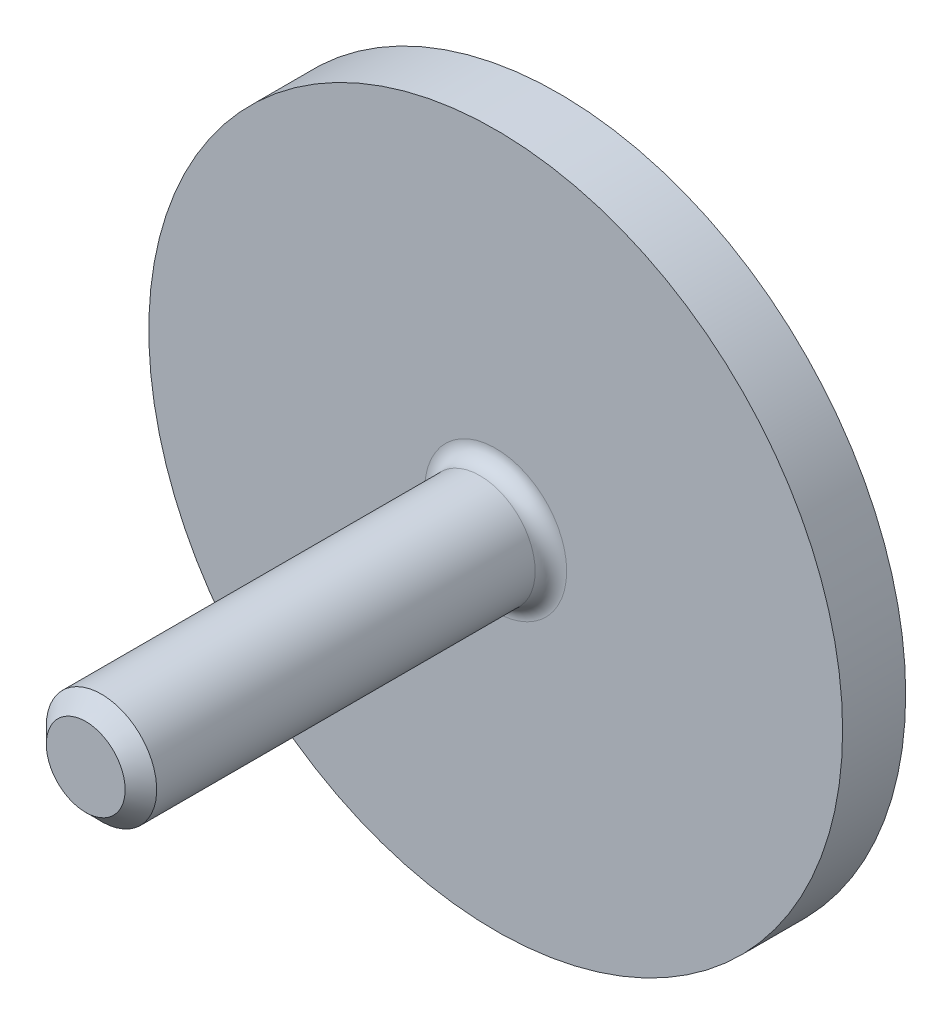
ISO-10303-21;
HEADER;
FILE_DESCRIPTION(('STEP AP214'),'2;1');
FILE_NAME('part.step','',(''),(''),'','','');
FILE_SCHEMA(('AUTOMOTIVE_DESIGN { 1 0 10303 214 1 1 1 1 }'));
ENDSEC;
DATA;
#1=APPLICATION_CONTEXT('core data for automotive mechanical design processes');
#2=APPLICATION_PROTOCOL_DEFINITION('international standard','automotive_design',2000,#1);
#3=PRODUCT_CONTEXT('',#1,'mechanical');
#4=PRODUCT('Part','Part','',(#3));
#5=PRODUCT_RELATED_PRODUCT_CATEGORY('part','',(#4));
#6=PRODUCT_DEFINITION_FORMATION('','',#4);
#7=PRODUCT_DEFINITION_CONTEXT('part definition',#1,'design');
#8=PRODUCT_DEFINITION('design','',#6,#7);
#9=PRODUCT_DEFINITION_SHAPE('','',#8);
#10=(LENGTH_UNIT() NAMED_UNIT(*) SI_UNIT(.MILLI.,.METRE.));
#11=(NAMED_UNIT(*) PLANE_ANGLE_UNIT() SI_UNIT($,.RADIAN.));
#12=(NAMED_UNIT(*) SI_UNIT($,.STERADIAN.) SOLID_ANGLE_UNIT());
#13=UNCERTAINTY_MEASURE_WITH_UNIT(LENGTH_MEASURE(1.E-05),#10,'distance_accuracy_value','');
#14=(GEOMETRIC_REPRESENTATION_CONTEXT(3) GLOBAL_UNCERTAINTY_ASSIGNED_CONTEXT((#13)) GLOBAL_UNIT_ASSIGNED_CONTEXT((#10,
#11,#12)) REPRESENTATION_CONTEXT('',''));
#15=CARTESIAN_POINT('',(0.,0.,0.));
#16=DIRECTION('',(0.,0.,1.));
#17=DIRECTION('',(1.,0.,0.));
#18=AXIS2_PLACEMENT_3D('',#15,#16,#17);
#19=CARTESIAN_POINT('',(0.,0.,2.));
#20=DIRECTION('',(0.,0.,1.));
#21=DIRECTION('',(1.,0.,0.));
#22=AXIS2_PLACEMENT_3D('',#19,#20,#21);
#23=PLANE('',#22);
#24=CARTESIAN_POINT('',(0.,0.,2.));
#25=DIRECTION('',(0.,0.,1.));
#26=DIRECTION('',(1.,0.,0.));
#27=AXIS2_PLACEMENT_3D('',#24,#25,#26);
#28=CIRCLE('',#27,2.25);
#29=CARTESIAN_POINT('',(2.25,0.,2.));
#30=VERTEX_POINT('',#29);
#31=EDGE_CURVE('E12',#30,#30,#28,.F.);
#32=ORIENTED_EDGE('',*,*,#31,.T.);
#33=EDGE_LOOP('',(#32));
#34=FACE_BOUND('',#33,.T.);
#35=CARTESIAN_POINT('',(0.,0.,2.));
#36=DIRECTION('',(0.,0.,1.));
#37=DIRECTION('',(1.,0.,0.));
#38=AXIS2_PLACEMENT_3D('',#35,#36,#37);
#39=CIRCLE('',#38,11.);
#40=CARTESIAN_POINT('',(11.,0.,2.));
#41=VERTEX_POINT('',#40);
#42=EDGE_CURVE('E61',#41,#41,#39,.T.);
#43=ORIENTED_EDGE('',*,*,#42,.T.);
#44=EDGE_LOOP('',(#43));
#45=FACE_BOUND('',#44,.T.);
#46=ADVANCED_FACE('F41',(#34,#45),#23,.T.);
#47=CARTESIAN_POINT('',(0.,0.,2.));
#48=DIRECTION('',(0.,0.,-1.));
#49=DIRECTION('',(-1.,0.,0.));
#50=AXIS2_PLACEMENT_3D('',#47,#48,#49);
#51=CYLINDRICAL_SURFACE('',#50,11.);
#52=ORIENTED_EDGE('',*,*,#42,.F.);
#53=EDGE_LOOP('',(#52));
#54=FACE_BOUND('',#53,.T.);
#55=CARTESIAN_POINT('',(0.,0.,0.));
#56=DIRECTION('',(0.,0.,1.));
#57=DIRECTION('',(1.,0.,0.));
#58=AXIS2_PLACEMENT_3D('',#55,#56,#57);
#59=CIRCLE('',#58,11.);
#60=CARTESIAN_POINT('',(11.,0.,0.));
#61=VERTEX_POINT('',#60);
#62=EDGE_CURVE('E62',#61,#61,#59,.T.);
#63=ORIENTED_EDGE('',*,*,#62,.T.);
#64=EDGE_LOOP('',(#63));
#65=FACE_BOUND('',#64,.T.);
#66=ADVANCED_FACE('F69',(#54,#65),#51,.T.);
#67=CARTESIAN_POINT('',(0.,0.,0.));
#68=DIRECTION('',(0.,0.,1.));
#69=DIRECTION('',(1.,0.,0.));
#70=AXIS2_PLACEMENT_3D('',#67,#68,#69);
#71=PLANE('',#70);
#72=ORIENTED_EDGE('',*,*,#62,.F.);
#73=EDGE_LOOP('',(#72));
#74=FACE_BOUND('',#73,.T.);
#75=ADVANCED_FACE('F72',(#74),#71,.F.);
#76=CARTESIAN_POINT('',(0.,0.,15.));
#77=DIRECTION('',(0.,0.,-1.));
#78=DIRECTION('',(-1.,0.,0.));
#79=AXIS2_PLACEMENT_3D('',#76,#77,#78);
#80=CYLINDRICAL_SURFACE('',#79,1.75);
#81=CARTESIAN_POINT('',(0.,0.,2.5));
#82=DIRECTION('',(0.,0.,1.));
#83=DIRECTION('',(1.,0.,0.));
#84=AXIS2_PLACEMENT_3D('',#81,#82,#83);
#85=CIRCLE('',#84,1.75);
#86=CARTESIAN_POINT('',(-1.75,0.,2.5));
#87=VERTEX_POINT('',#86);
#88=EDGE_CURVE('E48',#87,#87,#85,.T.);
#89=CARTESIAN_POINT('',(0.,0.,14.5));
#90=DIRECTION('',(0.,0.,1.));
#91=DIRECTION('',(1.,0.,0.));
#92=AXIS2_PLACEMENT_3D('',#89,#90,#91);
#93=CIRCLE('',#92,1.75);
#94=CARTESIAN_POINT('',(-1.75,0.,14.5));
#95=VERTEX_POINT('',#94);
#96=EDGE_CURVE('E52',#95,#95,#93,.F.);
#97=CARTESIAN_POINT('',(-1.75,0.,2.5));
#98=CARTESIAN_POINT('',(-1.75,0.,2.625));
#99=CARTESIAN_POINT('',(-1.75,0.,2.75));
#100=CARTESIAN_POINT('',(-1.75,0.,3.));
#101=CARTESIAN_POINT('',(-1.75,0.,3.125));
#102=CARTESIAN_POINT('',(-1.75,0.,3.375));
#103=CARTESIAN_POINT('',(-1.75,0.,3.5));
#104=CARTESIAN_POINT('',(-1.75,0.,3.75));
#105=CARTESIAN_POINT('',(-1.75,0.,3.875));
#106=CARTESIAN_POINT('',(-1.75,0.,4.125));
#107=CARTESIAN_POINT('',(-1.75,0.,4.25));
#108=CARTESIAN_POINT('',(-1.75,0.,4.5));
#109=CARTESIAN_POINT('',(-1.75,0.,4.625));
#110=CARTESIAN_POINT('',(-1.75,0.,4.875));
#111=CARTESIAN_POINT('',(-1.75,0.,5.));
#112=CARTESIAN_POINT('',(-1.75,0.,5.25));
#113=CARTESIAN_POINT('',(-1.75,0.,5.375));
#114=CARTESIAN_POINT('',(-1.75,0.,5.625));
#115=CARTESIAN_POINT('',(-1.75,0.,5.75));
#116=CARTESIAN_POINT('',(-1.75,0.,6.));
#117=CARTESIAN_POINT('',(-1.75,0.,6.125));
#118=CARTESIAN_POINT('',(-1.75,0.,6.375));
#119=CARTESIAN_POINT('',(-1.75,0.,6.5));
#120=CARTESIAN_POINT('',(-1.75,0.,6.75));
#121=CARTESIAN_POINT('',(-1.75,0.,6.875));
#122=CARTESIAN_POINT('',(-1.75,0.,7.125));
#123=CARTESIAN_POINT('',(-1.75,0.,7.25));
#124=CARTESIAN_POINT('',(-1.75,0.,7.5));
#125=CARTESIAN_POINT('',(-1.75,0.,7.625));
#126=CARTESIAN_POINT('',(-1.75,0.,7.875));
#127=CARTESIAN_POINT('',(-1.75,0.,8.));
#128=CARTESIAN_POINT('',(-1.75,0.,8.25));
#129=CARTESIAN_POINT('',(-1.75,0.,8.375));
#130=CARTESIAN_POINT('',(-1.75,0.,8.625));
#131=CARTESIAN_POINT('',(-1.75,0.,8.75));
#132=CARTESIAN_POINT('',(-1.75,0.,9.));
#133=CARTESIAN_POINT('',(-1.75,0.,9.125));
#134=CARTESIAN_POINT('',(-1.75,0.,9.375));
#135=CARTESIAN_POINT('',(-1.75,0.,9.5));
#136=CARTESIAN_POINT('',(-1.75,0.,9.75));
#137=CARTESIAN_POINT('',(-1.75,0.,9.875));
#138=CARTESIAN_POINT('',(-1.75,0.,10.125));
#139=CARTESIAN_POINT('',(-1.75,0.,10.25));
#140=CARTESIAN_POINT('',(-1.75,0.,10.5));
#141=CARTESIAN_POINT('',(-1.75,0.,10.625));
#142=CARTESIAN_POINT('',(-1.75,0.,10.875));
#143=CARTESIAN_POINT('',(-1.75,0.,11.));
#144=CARTESIAN_POINT('',(-1.75,0.,11.25));
#145=CARTESIAN_POINT('',(-1.75,0.,11.375));
#146=CARTESIAN_POINT('',(-1.75,0.,11.625));
#147=CARTESIAN_POINT('',(-1.75,0.,11.75));
#148=CARTESIAN_POINT('',(-1.75,0.,12.));
#149=CARTESIAN_POINT('',(-1.75,0.,12.125));
#150=CARTESIAN_POINT('',(-1.75,0.,12.375));
#151=CARTESIAN_POINT('',(-1.75,0.,12.5));
#152=CARTESIAN_POINT('',(-1.75,0.,12.75));
#153=CARTESIAN_POINT('',(-1.75,0.,12.875));
#154=CARTESIAN_POINT('',(-1.75,0.,13.125));
#155=CARTESIAN_POINT('',(-1.75,0.,13.25));
#156=CARTESIAN_POINT('',(-1.75,0.,13.5));
#157=CARTESIAN_POINT('',(-1.75,0.,13.625));
#158=CARTESIAN_POINT('',(-1.75,0.,13.875));
#159=CARTESIAN_POINT('',(-1.75,0.,14.));
#160=CARTESIAN_POINT('',(-1.75,0.,14.25));
#161=CARTESIAN_POINT('',(-1.75,0.,14.375));
#162=CARTESIAN_POINT('',(-1.75,0.,14.5));
#163=B_SPLINE_CURVE_WITH_KNOTS('',3,(#97,#98,#99,#100,#101,#102,#103,#104,#105,#106,#107,#108,
#109,#110,#111,#112,#113,#114,#115,#116,#117,#118,#119,#120,#121,#122,#123,#124,#125,#126,#127,
#128,#129,#130,#131,#132,#133,#134,#135,#136,#137,#138,#139,#140,#141,#142,#143,#144,#145,#146,
#147,#148,#149,#150,#151,#152,#153,#154,#155,#156,#157,#158,#159,#160,#161,#162),.UNSPECIFIED.,
.F.,.F.,(4,2,2,2,2,2,2,2,2,2,2,2,2,2,2,2,2,2,2,2,2,2,2,2,2,2,2,2,2,2,2,2,4),(0.,0.375,
0.750000000000001,1.125,1.5,1.875,2.25,2.625,3.,3.375,3.75,4.125,4.5,4.875,5.25,5.625,6.,6.375,
6.75,7.125,7.5,7.875,8.25,8.625,9.,9.375,9.75,10.125,10.5,10.875,11.25,11.625,12.),.UNSPECIFIED.);
#164=EDGE_CURVE('BSEAM77',#87,#95,#163,.T.);
#165=ORIENTED_EDGE('',*,*,#88,.T.);
#166=ORIENTED_EDGE('',*,*,#96,.T.);
#167=ORIENTED_EDGE('',*,*,#164,.T.);
#168=ORIENTED_EDGE('',*,*,#164,.F.);
#169=EDGE_LOOP('',(#165,#167,#166,#168));
#170=FACE_BOUND('',#169,.T.);
#171=ADVANCED_FACE('F77',(#170),#80,.T.);
#172=CARTESIAN_POINT('',(0.,0.,15.));
#173=DIRECTION('',(0.,0.,1.));
#174=DIRECTION('',(1.,0.,0.));
#175=AXIS2_PLACEMENT_3D('',#172,#173,#174);
#176=PLANE('',#175);
#177=CARTESIAN_POINT('',(0.,0.,15.));
#178=DIRECTION('',(0.,0.,1.));
#179=DIRECTION('',(1.,0.,0.));
#180=AXIS2_PLACEMENT_3D('',#177,#178,#179);
#181=CIRCLE('',#180,1.25);
#182=CARTESIAN_POINT('',(1.25,0.,15.));
#183=VERTEX_POINT('',#182);
#184=EDGE_CURVE('E56',#183,#183,#181,.T.);
#185=ORIENTED_EDGE('',*,*,#184,.T.);
#186=EDGE_LOOP('',(#185));
#187=FACE_BOUND('',#186,.T.);
#188=ADVANCED_FACE('F82',(#187),#176,.T.);
#189=CARTESIAN_POINT('',(0.,0.,15.));
#190=DIRECTION('',(0.,0.,-1.));
#191=DIRECTION('',(-1.,0.,0.));
#192=AXIS2_PLACEMENT_3D('',#189,#190,#191);
#193=CONICAL_SURFACE('',#192,1.25,0.785398163397446);
#194=ORIENTED_EDGE('',*,*,#96,.F.);
#195=EDGE_LOOP('',(#194));
#196=FACE_BOUND('',#195,.T.);
#197=ORIENTED_EDGE('',*,*,#184,.F.);
#198=EDGE_LOOP('',(#197));
#199=FACE_BOUND('',#198,.T.);
#200=ADVANCED_FACE('F90',(#196,#199),#193,.T.);
#201=CARTESIAN_POINT('',(0.,0.,2.5));
#202=DIRECTION('',(0.,0.,1.));
#203=DIRECTION('',(1.,0.,0.));
#204=AXIS2_PLACEMENT_3D('',#201,#202,#203);
#205=TOROIDAL_SURFACE('',#204,2.25,0.5);
#206=ORIENTED_EDGE('',*,*,#31,.F.);
#207=EDGE_LOOP('',(#206));
#208=FACE_BOUND('',#207,.T.);
#209=ORIENTED_EDGE('',*,*,#88,.F.);
#210=EDGE_LOOP('',(#209));
#211=FACE_BOUND('',#210,.T.);
#212=ADVANCED_FACE('F43',(#208,#211),#205,.F.);
#213=CLOSED_SHELL('',(#46,#66,#75,#171,#188,#200,#212));
#214=MANIFOLD_SOLID_BREP('B2',#213);
#215=ADVANCED_BREP_SHAPE_REPRESENTATION('',(#18,#214),#14);
#216=SHAPE_DEFINITION_REPRESENTATION(#9,#215);
ENDSEC;
END-ISO-10303-21;
